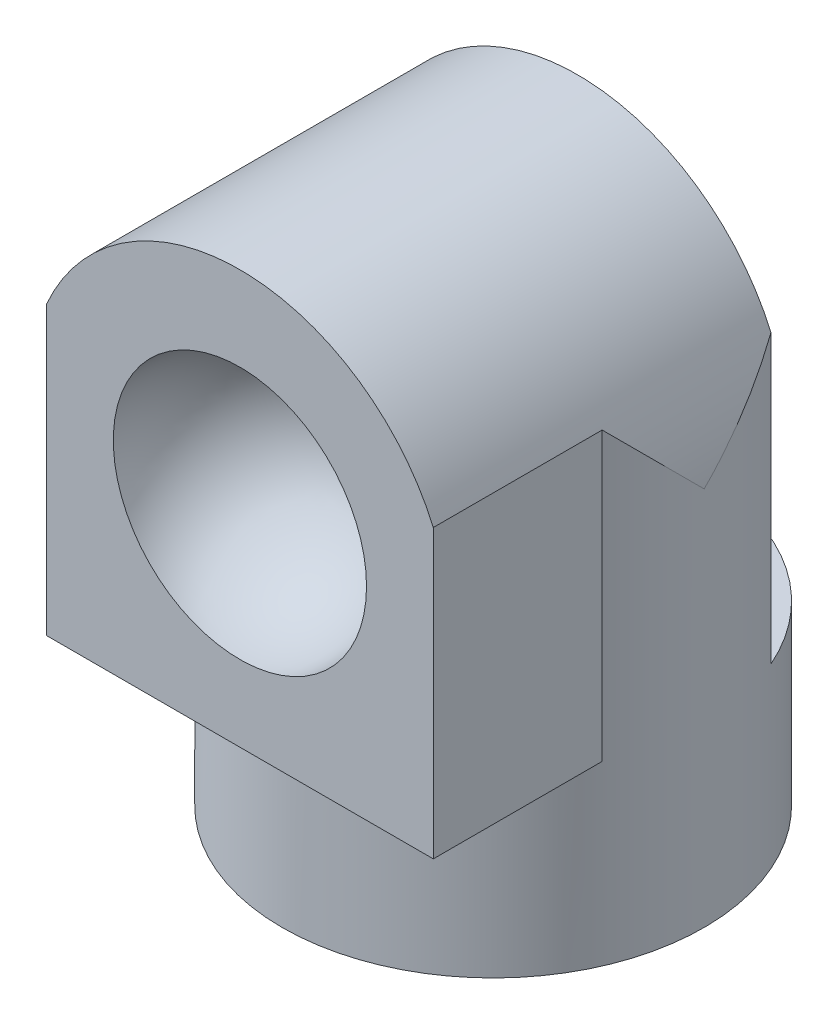
ISO-10303-21;
HEADER;
FILE_DESCRIPTION(('STEP AP214'),'2;1');
FILE_NAME('part.step','',(''),(''),'','','');
FILE_SCHEMA(('AUTOMOTIVE_DESIGN { 1 0 10303 214 1 1 1 1 }'));
ENDSEC;
DATA;
#1=APPLICATION_CONTEXT('core data for automotive mechanical design processes');
#2=APPLICATION_PROTOCOL_DEFINITION('international standard','automotive_design',2000,#1);
#3=PRODUCT_CONTEXT('',#1,'mechanical');
#4=PRODUCT('Part','Part','',(#3));
#5=PRODUCT_RELATED_PRODUCT_CATEGORY('part','',(#4));
#6=PRODUCT_DEFINITION_FORMATION('','',#4);
#7=PRODUCT_DEFINITION_CONTEXT('part definition',#1,'design');
#8=PRODUCT_DEFINITION('design','',#6,#7);
#9=PRODUCT_DEFINITION_SHAPE('','',#8);
#10=(LENGTH_UNIT() NAMED_UNIT(*) SI_UNIT(.MILLI.,.METRE.));
#11=(NAMED_UNIT(*) PLANE_ANGLE_UNIT() SI_UNIT($,.RADIAN.));
#12=(NAMED_UNIT(*) SI_UNIT($,.STERADIAN.) SOLID_ANGLE_UNIT());
#13=UNCERTAINTY_MEASURE_WITH_UNIT(LENGTH_MEASURE(1.E-05),#10,'distance_accuracy_value','');
#14=(GEOMETRIC_REPRESENTATION_CONTEXT(3) GLOBAL_UNCERTAINTY_ASSIGNED_CONTEXT((#13)) GLOBAL_UNIT_ASSIGNED_CONTEXT((#10,
#11,#12)) REPRESENTATION_CONTEXT('',''));
#15=CARTESIAN_POINT('',(0.,0.,0.));
#16=DIRECTION('',(0.,0.,1.));
#17=DIRECTION('',(1.,0.,0.));
#18=AXIS2_PLACEMENT_3D('',#15,#16,#17);
#19=CARTESIAN_POINT('',(0.,0.,0.));
#20=DIRECTION('',(0.,1.,0.));
#21=DIRECTION('',(0.,0.,1.));
#22=AXIS2_PLACEMENT_3D('',#19,#20,#21);
#23=PLANE('',#22);
#24=CARTESIAN_POINT('',(0.,0.,0.));
#25=DIRECTION('',(0.,-1.,0.));
#26=DIRECTION('',(0.,0.,-1.));
#27=AXIS2_PLACEMENT_3D('',#24,#25,#26);
#28=CIRCLE('',#27,1.);
#29=CARTESIAN_POINT('',(0.,0.,-1.));
#30=VERTEX_POINT('',#29);
#31=EDGE_CURVE('E143',#30,#30,#28,.T.);
#32=ORIENTED_EDGE('',*,*,#31,.F.);
#33=EDGE_LOOP('',(#32));
#34=FACE_BOUND('',#33,.T.);
#35=CARTESIAN_POINT('',(0.,0.,0.));
#36=DIRECTION('',(0.,1.,0.));
#37=DIRECTION('',(0.,0.,1.));
#38=AXIS2_PLACEMENT_3D('',#35,#36,#37);
#39=CIRCLE('',#38,2.5);
#40=CARTESIAN_POINT('',(0.,0.,2.5));
#41=VERTEX_POINT('',#40);
#42=EDGE_CURVE('E154',#41,#41,#39,.T.);
#43=ORIENTED_EDGE('',*,*,#42,.F.);
#44=EDGE_LOOP('',(#43));
#45=FACE_BOUND('',#44,.T.);
#46=ADVANCED_FACE('F44',(#34,#45),#23,.F.);
#47=CARTESIAN_POINT('',(0.,4.5,-1.));
#48=DIRECTION('',(0.,0.,1.));
#49=DIRECTION('',(1.,0.,0.));
#50=AXIS2_PLACEMENT_3D('',#47,#48,#49);
#51=PLANE('',#50);
#52=DIRECTION('',(0.,-1.,0.));
#53=VECTOR('',#52,1.);
#54=CARTESIAN_POINT('',(-2.29128784747792,7.,-1.));
#55=LINE('',#54,#53);
#56=CARTESIAN_POINT('',(-2.29128784747792,5.5,-1.));
#57=VERTEX_POINT('',#56);
#58=CARTESIAN_POINT('',(-2.29128784747792,2.1,-1.));
#59=VERTEX_POINT('',#58);
#60=EDGE_CURVE('E141',#57,#59,#55,.T.);
#61=ORIENTED_EDGE('',*,*,#60,.F.);
#62=CARTESIAN_POINT('',(0.,4.5,-1.));
#63=DIRECTION('',(0.,0.,1.));
#64=DIRECTION('',(1.,0.,0.));
#65=AXIS2_PLACEMENT_3D('',#62,#63,#64);
#66=CIRCLE('',#65,2.5);
#67=CARTESIAN_POINT('',(2.29128784747792,5.5,-1.));
#68=VERTEX_POINT('',#67);
#69=EDGE_CURVE('E147',#68,#57,#66,.T.);
#70=ORIENTED_EDGE('',*,*,#69,.F.);
#71=DIRECTION('',(0.,-1.,0.));
#72=VECTOR('',#71,1.);
#73=CARTESIAN_POINT('',(2.29128784747792,7.,-1.));
#74=LINE('',#73,#72);
#75=CARTESIAN_POINT('',(2.29128784747792,2.1,-1.));
#76=VERTEX_POINT('',#75);
#77=EDGE_CURVE('E138',#76,#68,#74,.F.);
#78=ORIENTED_EDGE('',*,*,#77,.F.);
#79=DIRECTION('',(1.,0.,0.));
#80=VECTOR('',#79,1.);
#81=CARTESIAN_POINT('',(0.,2.1,-1.));
#82=LINE('',#81,#80);
#83=EDGE_CURVE('E152',#59,#76,#82,.T.);
#84=ORIENTED_EDGE('',*,*,#83,.F.);
#85=EDGE_LOOP('',(#61,#70,#78,#84));
#86=FACE_BOUND('',#85,.T.);
#87=ADVANCED_FACE('F161',(#86),#51,.F.);
#88=CARTESIAN_POINT('',(0.,4.5,1.));
#89=DIRECTION('',(0.,0.,-1.));
#90=DIRECTION('',(-1.,0.,0.));
#91=AXIS2_PLACEMENT_3D('',#88,#89,#90);
#92=CYLINDRICAL_SURFACE('',#91,2.5);
#93=CARTESIAN_POINT('',(0.,4.5,0.));
#94=DIRECTION('',(0.,-0.707106781186547,-0.707106781186547));
#95=DIRECTION('',(0.,0.707106781186547,-0.707106781186547));
#96=AXIS2_PLACEMENT_3D('',#93,#94,#95);
#97=ELLIPSE('',#96,3.53553390593274,2.5);
#98=CARTESIAN_POINT('',(2.5,4.5,0.));
#99=VERTEX_POINT('',#98);
#100=EDGE_CURVE('E68',#68,#99,#97,.T.);
#101=ORIENTED_EDGE('',*,*,#100,.F.);
#102=ORIENTED_EDGE('',*,*,#69,.T.);
#103=CARTESIAN_POINT('',(-2.5,4.5,0.));
#104=VERTEX_POINT('',#103);
#105=EDGE_CURVE('E139',#104,#57,#97,.T.);
#106=ORIENTED_EDGE('',*,*,#105,.F.);
#107=CARTESIAN_POINT('',(0.,4.5,0.));
#108=DIRECTION('',(0.,0.707106781186547,-0.707106781186547));
#109=DIRECTION('',(0.,-0.707106781186547,-0.707106781186547));
#110=AXIS2_PLACEMENT_3D('',#107,#108,#109);
#111=ELLIPSE('',#110,3.53553390593274,2.5);
#112=CARTESIAN_POINT('',(-2.29128784747792,5.5,1.));
#113=VERTEX_POINT('',#112);
#114=EDGE_CURVE('E130',#113,#104,#111,.F.);
#115=ORIENTED_EDGE('',*,*,#114,.F.);
#116=DIRECTION('',(0.,0.,-1.));
#117=VECTOR('',#116,1.);
#118=CARTESIAN_POINT('',(-2.29128784747792,5.5,3.));
#119=LINE('',#118,#117);
#120=CARTESIAN_POINT('',(-2.29128784747792,5.5,3.));
#121=VERTEX_POINT('',#120);
#122=EDGE_CURVE('E111',#121,#113,#119,.T.);
#123=ORIENTED_EDGE('',*,*,#122,.F.);
#124=CARTESIAN_POINT('',(0.,4.5,3.));
#125=DIRECTION('',(0.,0.,1.));
#126=DIRECTION('',(1.,0.,0.));
#127=AXIS2_PLACEMENT_3D('',#124,#125,#126);
#128=CIRCLE('',#127,2.5);
#129=CARTESIAN_POINT('',(2.29128784747792,5.5,3.));
#130=VERTEX_POINT('',#129);
#131=EDGE_CURVE('E104',#130,#121,#128,.T.);
#132=ORIENTED_EDGE('',*,*,#131,.F.);
#133=DIRECTION('',(0.,0.,-1.));
#134=VECTOR('',#133,1.);
#135=CARTESIAN_POINT('',(2.29128784747792,5.5,3.));
#136=LINE('',#135,#134);
#137=CARTESIAN_POINT('',(2.29128784747792,5.5,1.));
#138=VERTEX_POINT('',#137);
#139=EDGE_CURVE('E108',#130,#138,#136,.T.);
#140=ORIENTED_EDGE('',*,*,#139,.T.);
#141=EDGE_CURVE('E127',#99,#138,#111,.F.);
#142=ORIENTED_EDGE('',*,*,#141,.F.);
#143=EDGE_LOOP('',(#101,#102,#106,#115,#123,#132,#140,#142));
#144=FACE_BOUND('',#143,.T.);
#145=ADVANCED_FACE('F106',(#144),#92,.T.);
#146=CARTESIAN_POINT('',(0.,2.1,0.));
#147=DIRECTION('',(0.,1.,0.));
#148=DIRECTION('',(0.,0.,1.));
#149=AXIS2_PLACEMENT_3D('',#146,#147,#148);
#150=PLANE('',#149);
#151=CARTESIAN_POINT('',(0.,2.1,0.));
#152=DIRECTION('',(0.,1.,0.));
#153=DIRECTION('',(0.,0.,1.));
#154=AXIS2_PLACEMENT_3D('',#151,#152,#153);
#155=CIRCLE('',#154,2.5);
#156=EDGE_CURVE('E12',#76,#59,#155,.T.);
#157=ORIENTED_EDGE('',*,*,#156,.T.);
#158=ORIENTED_EDGE('',*,*,#83,.T.);
#159=EDGE_LOOP('',(#157,#158));
#160=FACE_BOUND('',#159,.T.);
#161=ADVANCED_FACE('F170',(#160),#150,.T.);
#162=CARTESIAN_POINT('',(0.,2.1,0.));
#163=DIRECTION('',(0.,-1.,0.));
#164=DIRECTION('',(0.,0.,-1.));
#165=AXIS2_PLACEMENT_3D('',#162,#163,#164);
#166=CYLINDRICAL_SURFACE('',#165,2.5);
#167=ORIENTED_EDGE('',*,*,#42,.T.);
#168=EDGE_LOOP('',(#167));
#169=FACE_BOUND('',#168,.T.);
#170=CARTESIAN_POINT('',(-2.29128784747792,2.1,1.));
#171=VERTEX_POINT('',#170);
#172=CARTESIAN_POINT('',(2.29128784747792,2.1,1.));
#173=VERTEX_POINT('',#172);
#174=EDGE_CURVE('E53',#171,#173,#155,.T.);
#175=ORIENTED_EDGE('',*,*,#174,.F.);
#176=DIRECTION('',(0.,-1.,0.));
#177=VECTOR('',#176,1.);
#178=CARTESIAN_POINT('',(-2.29128784747792,7.,1.));
#179=LINE('',#178,#177);
#180=EDGE_CURVE('E61',#113,#171,#179,.T.);
#181=ORIENTED_EDGE('',*,*,#180,.F.);
#182=ORIENTED_EDGE('',*,*,#114,.T.);
#183=ORIENTED_EDGE('',*,*,#105,.T.);
#184=ORIENTED_EDGE('',*,*,#60,.T.);
#185=ORIENTED_EDGE('',*,*,#156,.F.);
#186=ORIENTED_EDGE('',*,*,#77,.T.);
#187=ORIENTED_EDGE('',*,*,#100,.T.);
#188=ORIENTED_EDGE('',*,*,#141,.T.);
#189=DIRECTION('',(0.,-1.,0.));
#190=VECTOR('',#189,1.);
#191=CARTESIAN_POINT('',(2.29128784747792,7.,1.));
#192=LINE('',#191,#190);
#193=EDGE_CURVE('E126',#173,#138,#192,.F.);
#194=ORIENTED_EDGE('',*,*,#193,.F.);
#195=EDGE_LOOP('',(#175,#181,#182,#183,#184,#185,#186,#187,#188,#194));
#196=FACE_BOUND('',#195,.T.);
#197=ADVANCED_FACE('F46',(#169,#196),#166,.T.);
#198=CARTESIAN_POINT('',(0.,2.,0.));
#199=DIRECTION('',(0.,-1.,0.));
#200=DIRECTION('',(0.,0.,-1.));
#201=AXIS2_PLACEMENT_3D('',#198,#199,#200);
#202=CYLINDRICAL_SURFACE('',#201,1.);
#203=CARTESIAN_POINT('',(0.,2.,0.));
#204=DIRECTION('',(0.,-1.,0.));
#205=DIRECTION('',(0.,0.,-1.));
#206=AXIS2_PLACEMENT_3D('',#203,#204,#205);
#207=CIRCLE('',#206,1.);
#208=CARTESIAN_POINT('',(0.,2.,-1.));
#209=VERTEX_POINT('',#208);
#210=EDGE_CURVE('E144',#209,#209,#207,.T.);
#211=ORIENTED_EDGE('',*,*,#210,.F.);
#212=EDGE_LOOP('',(#211));
#213=FACE_BOUND('',#212,.T.);
#214=ORIENTED_EDGE('',*,*,#31,.T.);
#215=EDGE_LOOP('',(#214));
#216=FACE_BOUND('',#215,.T.);
#217=ADVANCED_FACE('F176',(#213,#216),#202,.F.);
#218=CARTESIAN_POINT('',(0.,2.,0.));
#219=DIRECTION('',(0.,-1.,0.));
#220=DIRECTION('',(0.,0.,-1.));
#221=AXIS2_PLACEMENT_3D('',#218,#219,#220);
#222=PLANE('',#221);
#223=ORIENTED_EDGE('',*,*,#210,.T.);
#224=EDGE_LOOP('',(#223));
#225=FACE_BOUND('',#224,.T.);
#226=ADVANCED_FACE('F179',(#225),#222,.T.);
#227=CARTESIAN_POINT('',(2.29128784747792,0.,3.));
#228=DIRECTION('',(-1.,0.,0.));
#229=DIRECTION('',(0.,0.,1.));
#230=AXIS2_PLACEMENT_3D('',#227,#228,#229);
#231=PLANE('',#230);
#232=ORIENTED_EDGE('',*,*,#193,.T.);
#233=ORIENTED_EDGE('',*,*,#139,.F.);
#234=DIRECTION('',(0.,1.,0.));
#235=VECTOR('',#234,1.);
#236=CARTESIAN_POINT('',(2.29128784747792,0.,3.));
#237=LINE('',#236,#235);
#238=CARTESIAN_POINT('',(2.29128784747792,2.1,3.));
#239=VERTEX_POINT('',#238);
#240=EDGE_CURVE('E115',#239,#130,#237,.T.);
#241=ORIENTED_EDGE('',*,*,#240,.F.);
#242=DIRECTION('',(0.,0.,-1.));
#243=VECTOR('',#242,1.);
#244=CARTESIAN_POINT('',(2.29128784747792,2.1,3.));
#245=LINE('',#244,#243);
#246=EDGE_CURVE('E320',#239,#173,#245,.T.);
#247=ORIENTED_EDGE('',*,*,#246,.T.);
#248=EDGE_LOOP('',(#232,#233,#241,#247));
#249=FACE_BOUND('',#248,.T.);
#250=ADVANCED_FACE('F125',(#249),#231,.F.);
#251=CARTESIAN_POINT('',(-2.29128784747792,0.,3.));
#252=DIRECTION('',(1.,0.,0.));
#253=DIRECTION('',(0.,0.,-1.));
#254=AXIS2_PLACEMENT_3D('',#251,#252,#253);
#255=PLANE('',#254);
#256=ORIENTED_EDGE('',*,*,#180,.T.);
#257=DIRECTION('',(0.,0.,-1.));
#258=VECTOR('',#257,1.);
#259=CARTESIAN_POINT('',(-2.29128784747792,2.1,3.));
#260=LINE('',#259,#258);
#261=CARTESIAN_POINT('',(-2.29128784747792,2.1,3.));
#262=VERTEX_POINT('',#261);
#263=EDGE_CURVE('E131',#262,#171,#260,.T.);
#264=ORIENTED_EDGE('',*,*,#263,.F.);
#265=DIRECTION('',(0.,-1.,0.));
#266=VECTOR('',#265,1.);
#267=CARTESIAN_POINT('',(-2.29128784747792,0.,3.));
#268=LINE('',#267,#266);
#269=EDGE_CURVE('E114',#121,#262,#268,.T.);
#270=ORIENTED_EDGE('',*,*,#269,.F.);
#271=ORIENTED_EDGE('',*,*,#122,.T.);
#272=EDGE_LOOP('',(#256,#264,#270,#271));
#273=FACE_BOUND('',#272,.T.);
#274=ADVANCED_FACE('F186',(#273),#255,.F.);
#275=CARTESIAN_POINT('',(0.,2.1,3.));
#276=DIRECTION('',(0.,1.,0.));
#277=DIRECTION('',(0.,0.,1.));
#278=AXIS2_PLACEMENT_3D('',#275,#276,#277);
#279=PLANE('',#278);
#280=ORIENTED_EDGE('',*,*,#263,.T.);
#281=ORIENTED_EDGE('',*,*,#174,.T.);
#282=ORIENTED_EDGE('',*,*,#246,.F.);
#283=DIRECTION('',(1.,0.,0.));
#284=VECTOR('',#283,1.);
#285=CARTESIAN_POINT('',(0.,2.1,3.));
#286=LINE('',#285,#284);
#287=EDGE_CURVE('E120',#262,#239,#286,.T.);
#288=ORIENTED_EDGE('',*,*,#287,.F.);
#289=EDGE_LOOP('',(#280,#281,#282,#288));
#290=FACE_BOUND('',#289,.T.);
#291=ADVANCED_FACE('F189',(#290),#279,.F.);
#292=CARTESIAN_POINT('',(0.,0.,3.));
#293=DIRECTION('',(0.,0.,1.));
#294=DIRECTION('',(1.,0.,0.));
#295=AXIS2_PLACEMENT_3D('',#292,#293,#294);
#296=PLANE('',#295);
#297=CARTESIAN_POINT('',(0.,4.5,3.));
#298=DIRECTION('',(0.,0.,1.));
#299=DIRECTION('',(1.,0.,0.));
#300=AXIS2_PLACEMENT_3D('',#297,#298,#299);
#301=CIRCLE('',#300,1.5);
#302=CARTESIAN_POINT('',(1.5,4.5,3.));
#303=VERTEX_POINT('',#302);
#304=EDGE_CURVE('E48',#303,#303,#301,.F.);
#305=ORIENTED_EDGE('',*,*,#304,.T.);
#306=EDGE_LOOP('',(#305));
#307=FACE_BOUND('',#306,.T.);
#308=ORIENTED_EDGE('',*,*,#240,.T.);
#309=ORIENTED_EDGE('',*,*,#131,.T.);
#310=ORIENTED_EDGE('',*,*,#269,.T.);
#311=ORIENTED_EDGE('',*,*,#287,.T.);
#312=EDGE_LOOP('',(#308,#309,#310,#311));
#313=FACE_BOUND('',#312,.T.);
#314=ADVANCED_FACE('F118',(#307,#313),#296,.T.);
#315=CARTESIAN_POINT('',(0.,4.5,3.));
#316=DIRECTION('',(-1.,0.,0.));
#317=DIRECTION('',(0.,1.,0.));
#318=AXIS2_PLACEMENT_3D('',#315,#316,#317);
#319=SPHERICAL_SURFACE('',#318,1.5);
#320=CARTESIAN_POINT('',(0.,4.5,3.));
#321=DIRECTION('',(0.,0.,1.));
#322=DIRECTION('',(1.,0.,0.));
#323=AXIS2_PLACEMENT_3D('',#320,#321,#322);
#324=SPHERICAL_SURFACE('',#323,1.5);
#325=ORIENTED_EDGE('',*,*,#304,.F.);
#326=EDGE_LOOP('',(#325));
#327=FACE_BOUND('',#326,.T.);
#328=ADVANCED_FACE('F196',(#327),#324,.F.);
#329=CLOSED_SHELL('',(#46,#87,#145,#161,#197,#217,#226,#250,#274,#291,#314,#328));
#330=MANIFOLD_SOLID_BREP('B2',#329);
#331=ADVANCED_BREP_SHAPE_REPRESENTATION('',(#18,#330),#14);
#332=SHAPE_DEFINITION_REPRESENTATION(#9,#331);
ENDSEC;
END-ISO-10303-21;
